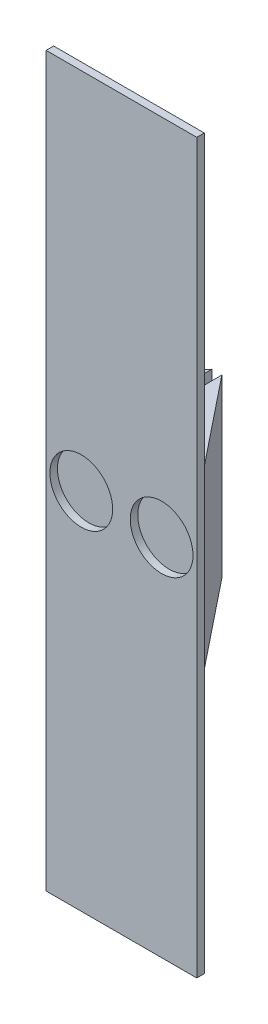
ISO-10303-21;
HEADER;
FILE_DESCRIPTION(('STEP AP214'),'2;1');
FILE_NAME('part.step','',(''),(''),'','','');
FILE_SCHEMA(('AUTOMOTIVE_DESIGN { 1 0 10303 214 1 1 1 1 }'));
ENDSEC;
DATA;
#1=APPLICATION_CONTEXT('core data for automotive mechanical design processes');
#2=APPLICATION_PROTOCOL_DEFINITION('international standard','automotive_design',2000,#1);
#3=PRODUCT_CONTEXT('',#1,'mechanical');
#4=PRODUCT('Part','Part','',(#3));
#5=PRODUCT_RELATED_PRODUCT_CATEGORY('part','',(#4));
#6=PRODUCT_DEFINITION_FORMATION('','',#4);
#7=PRODUCT_DEFINITION_CONTEXT('part definition',#1,'design');
#8=PRODUCT_DEFINITION('design','',#6,#7);
#9=PRODUCT_DEFINITION_SHAPE('','',#8);
#10=(LENGTH_UNIT() NAMED_UNIT(*) SI_UNIT(.MILLI.,.METRE.));
#11=(NAMED_UNIT(*) PLANE_ANGLE_UNIT() SI_UNIT($,.RADIAN.));
#12=(NAMED_UNIT(*) SI_UNIT($,.STERADIAN.) SOLID_ANGLE_UNIT());
#13=UNCERTAINTY_MEASURE_WITH_UNIT(LENGTH_MEASURE(1.E-05),#10,'distance_accuracy_value','');
#14=(GEOMETRIC_REPRESENTATION_CONTEXT(3) GLOBAL_UNCERTAINTY_ASSIGNED_CONTEXT((#13)) GLOBAL_UNIT_ASSIGNED_CONTEXT((#10,
#11,#12)) REPRESENTATION_CONTEXT('',''));
#15=CARTESIAN_POINT('',(0.,0.,0.));
#16=DIRECTION('',(0.,0.,1.));
#17=DIRECTION('',(1.,0.,0.));
#18=AXIS2_PLACEMENT_3D('',#15,#16,#17);
#19=CARTESIAN_POINT('',(12.3476340136044,41.5978509282442,-35.));
#20=DIRECTION('',(-1.,0.,0.));
#21=DIRECTION('',(0.,0.,1.));
#22=AXIS2_PLACEMENT_3D('',#19,#20,#21);
#23=PLANE('',#22);
#24=DIRECTION('',(0.,0.,-1.));
#25=VECTOR('',#24,1.);
#26=CARTESIAN_POINT('',(12.3476340136044,41.5978509282442,0.));
#27=LINE('',#26,#25);
#28=CARTESIAN_POINT('',(12.3476340136044,41.5978509282442,0.));
#29=VERTEX_POINT('',#28);
#30=CARTESIAN_POINT('',(12.3476340136044,41.5978509282442,-35.));
#31=VERTEX_POINT('',#30);
#32=EDGE_CURVE('E168',#29,#31,#27,.T.);
#33=ORIENTED_EDGE('',*,*,#32,.F.);
#34=DIRECTION('',(0.,-1.,0.));
#35=VECTOR('',#34,1.);
#36=CARTESIAN_POINT('',(12.3476340136044,41.5978509282442,0.));
#37=LINE('',#36,#35);
#38=CARTESIAN_POINT('',(12.3476340136044,-28.4021490717558,0.));
#39=VERTEX_POINT('',#38);
#40=EDGE_CURVE('E84',#29,#39,#37,.T.);
#41=ORIENTED_EDGE('',*,*,#40,.T.);
#42=DIRECTION('',(0.,0.,1.));
#43=VECTOR('',#42,1.);
#44=CARTESIAN_POINT('',(12.3476340136044,-28.4021490717558,0.));
#45=LINE('',#44,#43);
#46=CARTESIAN_POINT('',(12.3476340136044,-28.4021490717558,-35.));
#47=VERTEX_POINT('',#46);
#48=EDGE_CURVE('E177',#47,#39,#45,.T.);
#49=ORIENTED_EDGE('',*,*,#48,.F.);
#50=DIRECTION('',(0.,-1.,0.));
#51=VECTOR('',#50,1.);
#52=CARTESIAN_POINT('',(12.3476340136044,41.5978509282442,-35.));
#53=LINE('',#52,#51);
#54=EDGE_CURVE('E210',#31,#47,#53,.T.);
#55=ORIENTED_EDGE('',*,*,#54,.F.);
#56=EDGE_LOOP('',(#33,#41,#49,#55));
#57=FACE_BOUND('',#56,.T.);
#58=ADVANCED_FACE('F41',(#57),#23,.F.);
#59=CARTESIAN_POINT('',(16.3476340136044,41.5978509282442,-35.));
#60=DIRECTION('',(1.,0.,0.));
#61=DIRECTION('',(0.,0.,-1.));
#62=AXIS2_PLACEMENT_3D('',#59,#60,#61);
#63=PLANE('',#62);
#64=DIRECTION('',(0.,1.,0.));
#65=VECTOR('',#64,1.);
#66=CARTESIAN_POINT('',(16.3476340136044,41.5978509282442,0.));
#67=LINE('',#66,#65);
#68=CARTESIAN_POINT('',(16.3476340136044,-28.4021490717558,0.));
#69=VERTEX_POINT('',#68);
#70=CARTESIAN_POINT('',(16.3476340136044,41.5978509282442,0.));
#71=VERTEX_POINT('',#70);
#72=EDGE_CURVE('E213',#69,#71,#67,.T.);
#73=ORIENTED_EDGE('',*,*,#72,.T.);
#74=DIRECTION('',(0.,0.,1.));
#75=VECTOR('',#74,1.);
#76=CARTESIAN_POINT('',(16.3476340136044,41.5978509282442,-35.));
#77=LINE('',#76,#75);
#78=CARTESIAN_POINT('',(16.3476340136044,41.5978509282442,-35.));
#79=VERTEX_POINT('',#78);
#80=EDGE_CURVE('E136',#79,#71,#77,.T.);
#81=ORIENTED_EDGE('',*,*,#80,.F.);
#82=DIRECTION('',(0.,1.,0.));
#83=VECTOR('',#82,1.);
#84=CARTESIAN_POINT('',(16.3476340136044,41.5978509282442,-35.));
#85=LINE('',#84,#83);
#86=CARTESIAN_POINT('',(16.3476340136045,-28.4021490717558,-35.));
#87=VERTEX_POINT('',#86);
#88=EDGE_CURVE('E56',#87,#79,#85,.T.);
#89=ORIENTED_EDGE('',*,*,#88,.F.);
#90=DIRECTION('',(0.,0.,-1.));
#91=VECTOR('',#90,1.);
#92=CARTESIAN_POINT('',(16.3476340136045,-28.4021490717558,-35.));
#93=LINE('',#92,#91);
#94=EDGE_CURVE('E176',#69,#87,#93,.T.);
#95=ORIENTED_EDGE('',*,*,#94,.F.);
#96=EDGE_LOOP('',(#73,#81,#89,#95));
#97=FACE_BOUND('',#96,.T.);
#98=ADVANCED_FACE('F228',(#97),#63,.F.);
#99=CARTESIAN_POINT('',(12.3476340136044,-18.4021490717558,-35.));
#100=DIRECTION('',(0.78086880944303,0.,0.624695047554424));
#101=DIRECTION('',(0.624695047554424,0.,-0.78086880944303));
#102=AXIS2_PLACEMENT_3D('',#99,#100,#101);
#103=PLANE('',#102);
#104=DIRECTION('',(-0.624695047554424,0.,0.78086880944303));
#105=VECTOR('',#104,1.);
#106=CARTESIAN_POINT('',(12.3476340136044,41.5978509282442,-35.));
#107=LINE('',#106,#105);
#108=CARTESIAN_POINT('',(-15.6523659863955,41.5978509282442,0.));
#109=VERTEX_POINT('',#108);
#110=EDGE_CURVE('E163',#31,#109,#107,.T.);
#111=ORIENTED_EDGE('',*,*,#110,.F.);
#112=ORIENTED_EDGE('',*,*,#54,.T.);
#113=DIRECTION('',(0.624695047554424,0.,-0.78086880944303));
#114=VECTOR('',#113,1.);
#115=CARTESIAN_POINT('',(12.3476340136044,-28.4021490717558,-35.));
#116=LINE('',#115,#114);
#117=CARTESIAN_POINT('',(-15.6523659863955,-28.4021490717558,0.));
#118=VERTEX_POINT('',#117);
#119=EDGE_CURVE('E172',#118,#47,#116,.T.);
#120=ORIENTED_EDGE('',*,*,#119,.F.);
#121=DIRECTION('',(0.,1.,0.));
#122=VECTOR('',#121,1.);
#123=CARTESIAN_POINT('',(-15.6523659863955,-18.4021490717558,0.));
#124=LINE('',#123,#122);
#125=EDGE_CURVE('E194',#118,#109,#124,.T.);
#126=ORIENTED_EDGE('',*,*,#125,.T.);
#127=EDGE_LOOP('',(#111,#112,#120,#126));
#128=FACE_BOUND('',#127,.T.);
#129=ADVANCED_FACE('F222',(#128),#103,.F.);
#130=CARTESIAN_POINT('',(16.3476340136044,-18.4021490717558,-35.));
#131=DIRECTION('',(-0.78086880944303,0.,0.624695047554424));
#132=DIRECTION('',(0.624695047554424,0.,0.78086880944303));
#133=AXIS2_PLACEMENT_3D('',#130,#131,#132);
#134=PLANE('',#133);
#135=DIRECTION('',(0.624695047554424,0.,0.78086880944303));
#136=VECTOR('',#135,1.);
#137=CARTESIAN_POINT('',(44.3476340136044,-28.4021490717558,0.));
#138=LINE('',#137,#136);
#139=CARTESIAN_POINT('',(44.3476340136044,-28.4021490717558,0.));
#140=VERTEX_POINT('',#139);
#141=EDGE_CURVE('E179',#87,#140,#138,.T.);
#142=ORIENTED_EDGE('',*,*,#141,.F.);
#143=ORIENTED_EDGE('',*,*,#88,.T.);
#144=DIRECTION('',(0.624695047554424,0.,0.78086880944303));
#145=VECTOR('',#144,1.);
#146=CARTESIAN_POINT('',(16.3476340136044,41.5978509282442,-35.));
#147=LINE('',#146,#145);
#148=CARTESIAN_POINT('',(44.3476340136044,41.5978509282442,0.));
#149=VERTEX_POINT('',#148);
#150=EDGE_CURVE('E203',#79,#149,#147,.T.);
#151=ORIENTED_EDGE('',*,*,#150,.T.);
#152=DIRECTION('',(0.,1.,0.));
#153=VECTOR('',#152,1.);
#154=CARTESIAN_POINT('',(44.3476340136044,-18.4021490717558,0.));
#155=LINE('',#154,#153);
#156=EDGE_CURVE('E205',#140,#149,#155,.T.);
#157=ORIENTED_EDGE('',*,*,#156,.F.);
#158=EDGE_LOOP('',(#142,#143,#151,#157));
#159=FACE_BOUND('',#158,.T.);
#160=ADVANCED_FACE('F248',(#159),#134,.F.);
#161=CARTESIAN_POINT('',(-15.6523659863955,41.5978509282442,3.));
#162=DIRECTION('',(0.,-1.,0.));
#163=DIRECTION('',(0.,0.,-1.));
#164=AXIS2_PLACEMENT_3D('',#161,#162,#163);
#165=PLANE('',#164);
#166=ORIENTED_EDGE('',*,*,#80,.T.);
#167=DIRECTION('',(1.,0.,0.));
#168=VECTOR('',#167,1.);
#169=CARTESIAN_POINT('',(16.3476340136044,41.5978509282442,0.));
#170=LINE('',#169,#168);
#171=EDGE_CURVE('E162',#71,#149,#170,.T.);
#172=ORIENTED_EDGE('',*,*,#171,.T.);
#173=ORIENTED_EDGE('',*,*,#150,.F.);
#174=EDGE_LOOP('',(#166,#172,#173));
#175=FACE_BOUND('',#174,.T.);
#176=ADVANCED_FACE('F246',(#175),#165,.F.);
#177=CARTESIAN_POINT('',(0.,0.,0.));
#178=DIRECTION('',(0.,0.,1.));
#179=DIRECTION('',(1.,0.,0.));
#180=AXIS2_PLACEMENT_3D('',#177,#178,#179);
#181=PLANE('',#180);
#182=ORIENTED_EDGE('',*,*,#72,.F.);
#183=DIRECTION('',(-1.,0.,0.));
#184=VECTOR('',#183,1.);
#185=CARTESIAN_POINT('',(16.3476340136044,-28.4021490717558,0.));
#186=LINE('',#185,#184);
#187=EDGE_CURVE('E65',#140,#69,#186,.T.);
#188=ORIENTED_EDGE('',*,*,#187,.F.);
#189=CARTESIAN_POINT('',(44.3476340136045,-133.402149071756,0.));
#190=VERTEX_POINT('',#189);
#191=EDGE_CURVE('E207',#190,#140,#155,.T.);
#192=ORIENTED_EDGE('',*,*,#191,.F.);
#193=DIRECTION('',(1.,0.,0.));
#194=VECTOR('',#193,1.);
#195=CARTESIAN_POINT('',(-15.6523659863955,-133.402149071756,0.));
#196=LINE('',#195,#194);
#197=CARTESIAN_POINT('',(-15.6523659863955,-133.402149071756,0.));
#198=VERTEX_POINT('',#197);
#199=EDGE_CURVE('E154',#198,#190,#196,.T.);
#200=ORIENTED_EDGE('',*,*,#199,.F.);
#201=EDGE_CURVE('E206',#198,#118,#124,.T.);
#202=ORIENTED_EDGE('',*,*,#201,.T.);
#203=DIRECTION('',(-1.,0.,0.));
#204=VECTOR('',#203,1.);
#205=CARTESIAN_POINT('',(-15.6523659863955,-28.4021490717558,0.));
#206=LINE('',#205,#204);
#207=EDGE_CURVE('E184',#39,#118,#206,.T.);
#208=ORIENTED_EDGE('',*,*,#207,.F.);
#209=ORIENTED_EDGE('',*,*,#40,.F.);
#210=DIRECTION('',(1.,0.,0.));
#211=VECTOR('',#210,1.);
#212=CARTESIAN_POINT('',(-15.6523659863955,41.5978509282442,0.));
#213=LINE('',#212,#211);
#214=EDGE_CURVE('E166',#109,#29,#213,.T.);
#215=ORIENTED_EDGE('',*,*,#214,.F.);
#216=DIRECTION('',(0.,1.,0.));
#217=VECTOR('',#216,1.);
#218=CARTESIAN_POINT('',(-15.6523659863955,41.5978509282442,0.));
#219=LINE('',#218,#217);
#220=CARTESIAN_POINT('',(-15.6523659863955,156.597850928244,0.));
#221=VERTEX_POINT('',#220);
#222=EDGE_CURVE('E170',#109,#221,#219,.T.);
#223=ORIENTED_EDGE('',*,*,#222,.T.);
#224=DIRECTION('',(-1.,0.,0.));
#225=VECTOR('',#224,1.);
#226=CARTESIAN_POINT('',(-15.6523659863955,156.597850928244,0.));
#227=LINE('',#226,#225);
#228=CARTESIAN_POINT('',(44.3476340136044,156.597850928244,0.));
#229=VERTEX_POINT('',#228);
#230=EDGE_CURVE('E148',#229,#221,#227,.T.);
#231=ORIENTED_EDGE('',*,*,#230,.F.);
#232=DIRECTION('',(0.,-1.,0.));
#233=VECTOR('',#232,1.);
#234=CARTESIAN_POINT('',(44.3476340136044,151.597850928244,0.));
#235=LINE('',#234,#233);
#236=EDGE_CURVE('E181',#229,#149,#235,.T.);
#237=ORIENTED_EDGE('',*,*,#236,.T.);
#238=ORIENTED_EDGE('',*,*,#171,.F.);
#239=EDGE_LOOP('',(#182,#188,#192,#200,#202,#208,#209,#215,#223,#231,#237,#238));
#240=FACE_BOUND('',#239,.T.);
#241=ADVANCED_FACE('F243',(#240),#181,.F.);
#242=CARTESIAN_POINT('',(-15.6523659863955,41.5978509282442,3.));
#243=DIRECTION('',(1.,0.,0.));
#244=DIRECTION('',(0.,1.,0.));
#245=AXIS2_PLACEMENT_3D('',#242,#243,#244);
#246=PLANE('',#245);
#247=DIRECTION('',(0.,-1.,0.));
#248=VECTOR('',#247,1.);
#249=CARTESIAN_POINT('',(-15.6523659863955,41.5978509282442,3.));
#250=LINE('',#249,#248);
#251=CARTESIAN_POINT('',(-15.6523659863955,156.597850928244,3.));
#252=VERTEX_POINT('',#251);
#253=CARTESIAN_POINT('',(-15.6523659863955,-133.402149071756,3.));
#254=VERTEX_POINT('',#253);
#255=EDGE_CURVE('E49',#252,#254,#250,.T.);
#256=ORIENTED_EDGE('',*,*,#255,.F.);
#257=DIRECTION('',(0.,0.,1.));
#258=VECTOR('',#257,1.);
#259=CARTESIAN_POINT('',(-15.6523659863955,156.597850928244,0.));
#260=LINE('',#259,#258);
#261=EDGE_CURVE('E130',#221,#252,#260,.T.);
#262=ORIENTED_EDGE('',*,*,#261,.F.);
#263=ORIENTED_EDGE('',*,*,#222,.F.);
#264=ORIENTED_EDGE('',*,*,#125,.F.);
#265=ORIENTED_EDGE('',*,*,#201,.F.);
#266=DIRECTION('',(0.,0.,-1.));
#267=VECTOR('',#266,1.);
#268=CARTESIAN_POINT('',(-15.6523659863955,-133.402149071756,3.));
#269=LINE('',#268,#267);
#270=EDGE_CURVE('E132',#254,#198,#269,.T.);
#271=ORIENTED_EDGE('',*,*,#270,.F.);
#272=EDGE_LOOP('',(#256,#262,#263,#264,#265,#271));
#273=FACE_BOUND('',#272,.T.);
#274=ADVANCED_FACE('F43',(#273),#246,.F.);
#275=CARTESIAN_POINT('',(44.3476340136044,41.5978509282442,3.));
#276=DIRECTION('',(-1.,0.,0.));
#277=DIRECTION('',(0.,-1.,0.));
#278=AXIS2_PLACEMENT_3D('',#275,#276,#277);
#279=PLANE('',#278);
#280=DIRECTION('',(0.,1.,0.));
#281=VECTOR('',#280,1.);
#282=CARTESIAN_POINT('',(44.3476340136044,41.5978509282442,3.));
#283=LINE('',#282,#281);
#284=CARTESIAN_POINT('',(44.3476340136045,-133.402149071756,3.));
#285=VERTEX_POINT('',#284);
#286=CARTESIAN_POINT('',(44.3476340136044,156.597850928244,3.));
#287=VERTEX_POINT('',#286);
#288=EDGE_CURVE('E11',#285,#287,#283,.T.);
#289=ORIENTED_EDGE('',*,*,#288,.F.);
#290=DIRECTION('',(0.,0.,1.));
#291=VECTOR('',#290,1.);
#292=CARTESIAN_POINT('',(44.3476340136045,-133.402149071756,3.));
#293=LINE('',#292,#291);
#294=EDGE_CURVE('E157',#190,#285,#293,.T.);
#295=ORIENTED_EDGE('',*,*,#294,.F.);
#296=ORIENTED_EDGE('',*,*,#191,.T.);
#297=ORIENTED_EDGE('',*,*,#156,.T.);
#298=ORIENTED_EDGE('',*,*,#236,.F.);
#299=DIRECTION('',(0.,0.,-1.));
#300=VECTOR('',#299,1.);
#301=CARTESIAN_POINT('',(44.3476340136044,156.597850928244,0.));
#302=LINE('',#301,#300);
#303=EDGE_CURVE('E143',#287,#229,#302,.T.);
#304=ORIENTED_EDGE('',*,*,#303,.F.);
#305=EDGE_LOOP('',(#289,#295,#296,#297,#298,#304));
#306=FACE_BOUND('',#305,.T.);
#307=ADVANCED_FACE('F241',(#306),#279,.F.);
#308=CARTESIAN_POINT('',(0.,0.,3.));
#309=DIRECTION('',(0.,0.,1.));
#310=DIRECTION('',(1.,0.,0.));
#311=AXIS2_PLACEMENT_3D('',#308,#309,#310);
#312=PLANE('',#311);
#313=CARTESIAN_POINT('',(-1.65236598639555,11.5978509282442,3.));
#314=DIRECTION('',(0.,0.,1.));
#315=DIRECTION('',(1.,0.,0.));
#316=AXIS2_PLACEMENT_3D('',#313,#314,#315);
#317=CIRCLE('',#316,12.5);
#318=CARTESIAN_POINT('',(10.8476340136045,11.5978509282442,3.));
#319=VERTEX_POINT('',#318);
#320=EDGE_CURVE('E195',#319,#319,#317,.T.);
#321=ORIENTED_EDGE('',*,*,#320,.F.);
#322=EDGE_LOOP('',(#321));
#323=FACE_BOUND('',#322,.T.);
#324=CARTESIAN_POINT('',(30.3476340136044,11.5978509282442,3.));
#325=DIRECTION('',(0.,0.,1.));
#326=DIRECTION('',(1.,0.,0.));
#327=AXIS2_PLACEMENT_3D('',#324,#325,#326);
#328=CIRCLE('',#327,12.5);
#329=CARTESIAN_POINT('',(42.8476340136044,11.5978509282442,3.));
#330=VERTEX_POINT('',#329);
#331=EDGE_CURVE('E190',#330,#330,#328,.T.);
#332=ORIENTED_EDGE('',*,*,#331,.F.);
#333=EDGE_LOOP('',(#332));
#334=FACE_BOUND('',#333,.T.);
#335=ORIENTED_EDGE('',*,*,#255,.T.);
#336=DIRECTION('',(-1.,0.,0.));
#337=VECTOR('',#336,1.);
#338=CARTESIAN_POINT('',(-15.6523659863955,-133.402149071756,3.));
#339=LINE('',#338,#337);
#340=EDGE_CURVE('E160',#285,#254,#339,.T.);
#341=ORIENTED_EDGE('',*,*,#340,.F.);
#342=ORIENTED_EDGE('',*,*,#288,.T.);
#343=DIRECTION('',(1.,0.,0.));
#344=VECTOR('',#343,1.);
#345=CARTESIAN_POINT('',(-15.6523659863955,156.597850928244,3.));
#346=LINE('',#345,#344);
#347=EDGE_CURVE('E138',#252,#287,#346,.T.);
#348=ORIENTED_EDGE('',*,*,#347,.F.);
#349=EDGE_LOOP('',(#335,#341,#342,#348));
#350=FACE_BOUND('',#349,.T.);
#351=ADVANCED_FACE('F139',(#323,#334,#350),#312,.T.);
#352=CARTESIAN_POINT('',(30.3476340136044,11.5978509282442,0.));
#353=DIRECTION('',(0.,0.,1.));
#354=DIRECTION('',(1.,0.,0.));
#355=AXIS2_PLACEMENT_3D('',#352,#353,#354);
#356=CYLINDRICAL_SURFACE('',#355,12.5);
#357=CARTESIAN_POINT('',(30.3476340136044,11.5978509282442,0.));
#358=DIRECTION('',(0.,0.,1.));
#359=DIRECTION('',(1.,0.,0.));
#360=AXIS2_PLACEMENT_3D('',#357,#358,#359);
#361=CIRCLE('',#360,12.5);
#362=CARTESIAN_POINT('',(42.8476340136044,11.5978509282442,0.));
#363=VERTEX_POINT('',#362);
#364=EDGE_CURVE('E198',#363,#363,#361,.T.);
#365=ORIENTED_EDGE('',*,*,#364,.F.);
#366=EDGE_LOOP('',(#365));
#367=FACE_BOUND('',#366,.T.);
#368=ORIENTED_EDGE('',*,*,#331,.T.);
#369=EDGE_LOOP('',(#368));
#370=FACE_BOUND('',#369,.T.);
#371=ADVANCED_FACE('F240',(#367,#370),#356,.F.);
#372=CARTESIAN_POINT('',(0.,0.,0.));
#373=DIRECTION('',(0.,0.,1.));
#374=DIRECTION('',(1.,0.,0.));
#375=AXIS2_PLACEMENT_3D('',#372,#373,#374);
#376=PLANE('',#375);
#377=ORIENTED_EDGE('',*,*,#364,.T.);
#378=EDGE_LOOP('',(#377));
#379=FACE_BOUND('',#378,.T.);
#380=ADVANCED_FACE('F284',(#379),#376,.T.);
#381=CARTESIAN_POINT('',(-1.65236598639555,11.5978509282442,0.));
#382=DIRECTION('',(0.,0.,1.));
#383=DIRECTION('',(1.,0.,0.));
#384=AXIS2_PLACEMENT_3D('',#381,#382,#383);
#385=CYLINDRICAL_SURFACE('',#384,12.5);
#386=CARTESIAN_POINT('',(-1.65236598639555,11.5978509282442,0.));
#387=DIRECTION('',(0.,0.,1.));
#388=DIRECTION('',(1.,0.,0.));
#389=AXIS2_PLACEMENT_3D('',#386,#387,#388);
#390=CIRCLE('',#389,12.5);
#391=CARTESIAN_POINT('',(10.8476340136045,11.5978509282442,0.));
#392=VERTEX_POINT('',#391);
#393=EDGE_CURVE('E191',#392,#392,#390,.T.);
#394=ORIENTED_EDGE('',*,*,#393,.F.);
#395=EDGE_LOOP('',(#394));
#396=FACE_BOUND('',#395,.T.);
#397=ORIENTED_EDGE('',*,*,#320,.T.);
#398=EDGE_LOOP('',(#397));
#399=FACE_BOUND('',#398,.T.);
#400=ADVANCED_FACE('F280',(#396,#399),#385,.F.);
#401=CARTESIAN_POINT('',(0.,0.,0.));
#402=DIRECTION('',(0.,0.,1.));
#403=DIRECTION('',(1.,0.,0.));
#404=AXIS2_PLACEMENT_3D('',#401,#402,#403);
#405=PLANE('',#404);
#406=ORIENTED_EDGE('',*,*,#393,.T.);
#407=EDGE_LOOP('',(#406));
#408=FACE_BOUND('',#407,.T.);
#409=ADVANCED_FACE('F277',(#408),#405,.T.);
#410=CARTESIAN_POINT('',(0.,-28.4021490717558,0.));
#411=DIRECTION('',(0.,-1.,0.));
#412=DIRECTION('',(0.,0.,-1.));
#413=AXIS2_PLACEMENT_3D('',#410,#411,#412);
#414=PLANE('',#413);
#415=ORIENTED_EDGE('',*,*,#48,.T.);
#416=ORIENTED_EDGE('',*,*,#207,.T.);
#417=ORIENTED_EDGE('',*,*,#119,.T.);
#418=EDGE_LOOP('',(#415,#416,#417));
#419=FACE_BOUND('',#418,.T.);
#420=ADVANCED_FACE('F226',(#419),#414,.T.);
#421=CARTESIAN_POINT('',(0.,-28.4021490717558,0.));
#422=DIRECTION('',(0.,-1.,0.));
#423=DIRECTION('',(0.,0.,-1.));
#424=AXIS2_PLACEMENT_3D('',#421,#422,#423);
#425=PLANE('',#424);
#426=ORIENTED_EDGE('',*,*,#187,.T.);
#427=ORIENTED_EDGE('',*,*,#94,.T.);
#428=ORIENTED_EDGE('',*,*,#141,.T.);
#429=EDGE_LOOP('',(#426,#427,#428));
#430=FACE_BOUND('',#429,.T.);
#431=ADVANCED_FACE('F266',(#430),#425,.T.);
#432=CARTESIAN_POINT('',(0.,41.5978509282442,0.));
#433=DIRECTION('',(0.,1.,0.));
#434=DIRECTION('',(0.,0.,1.));
#435=AXIS2_PLACEMENT_3D('',#432,#433,#434);
#436=PLANE('',#435);
#437=ORIENTED_EDGE('',*,*,#110,.T.);
#438=ORIENTED_EDGE('',*,*,#214,.T.);
#439=ORIENTED_EDGE('',*,*,#32,.T.);
#440=EDGE_LOOP('',(#437,#438,#439));
#441=FACE_BOUND('',#440,.T.);
#442=ADVANCED_FACE('F264',(#441),#436,.T.);
#443=CARTESIAN_POINT('',(0.,-133.402149071756,0.));
#444=DIRECTION('',(0.,-1.,0.));
#445=DIRECTION('',(0.,0.,-1.));
#446=AXIS2_PLACEMENT_3D('',#443,#444,#445);
#447=PLANE('',#446);
#448=ORIENTED_EDGE('',*,*,#270,.T.);
#449=ORIENTED_EDGE('',*,*,#199,.T.);
#450=ORIENTED_EDGE('',*,*,#294,.T.);
#451=ORIENTED_EDGE('',*,*,#340,.T.);
#452=EDGE_LOOP('',(#448,#449,#450,#451));
#453=FACE_BOUND('',#452,.T.);
#454=ADVANCED_FACE('F257',(#453),#447,.T.);
#455=CARTESIAN_POINT('',(0.,156.597850928244,0.));
#456=DIRECTION('',(0.,1.,0.));
#457=DIRECTION('',(0.,0.,1.));
#458=AXIS2_PLACEMENT_3D('',#455,#456,#457);
#459=PLANE('',#458);
#460=ORIENTED_EDGE('',*,*,#261,.T.);
#461=ORIENTED_EDGE('',*,*,#347,.T.);
#462=ORIENTED_EDGE('',*,*,#303,.T.);
#463=ORIENTED_EDGE('',*,*,#230,.T.);
#464=EDGE_LOOP('',(#460,#461,#462,#463));
#465=FACE_BOUND('',#464,.T.);
#466=ADVANCED_FACE('F146',(#465),#459,.T.);
#467=CLOSED_SHELL('',(#58,#98,#129,#160,#176,#241,#274,#307,#351,#371,#380,#400,#409,#420,#431,
#442,#454,#466));
#468=MANIFOLD_SOLID_BREP('B2',#467);
#469=ADVANCED_BREP_SHAPE_REPRESENTATION('',(#18,#468),#14);
#470=SHAPE_DEFINITION_REPRESENTATION(#9,#469);
ENDSEC;
END-ISO-10303-21;
